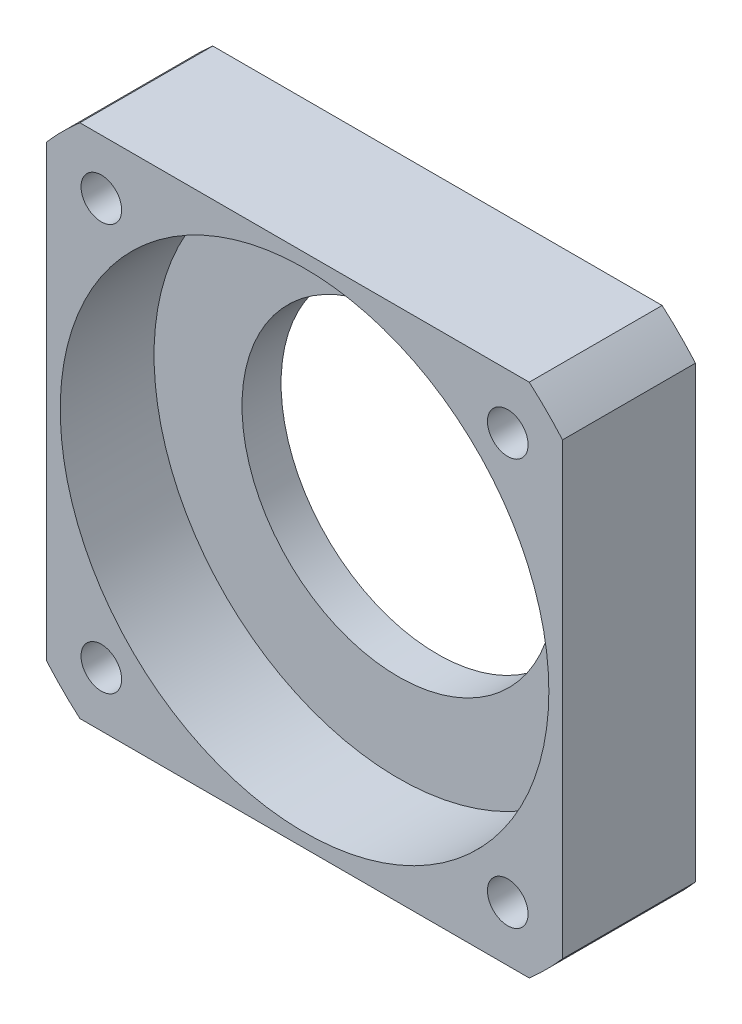
ISO-10303-21;
HEADER;
FILE_DESCRIPTION(('STEP AP214'),'2;1');
FILE_NAME('part.step','',(''),(''),'','','');
FILE_SCHEMA(('AUTOMOTIVE_DESIGN { 1 0 10303 214 1 1 1 1 }'));
ENDSEC;
DATA;
#1=APPLICATION_CONTEXT('core data for automotive mechanical design processes');
#2=APPLICATION_PROTOCOL_DEFINITION('international standard','automotive_design',2000,#1);
#3=PRODUCT_CONTEXT('',#1,'mechanical');
#4=PRODUCT('Part','Part','',(#3));
#5=PRODUCT_RELATED_PRODUCT_CATEGORY('part','',(#4));
#6=PRODUCT_DEFINITION_FORMATION('','',#4);
#7=PRODUCT_DEFINITION_CONTEXT('part definition',#1,'design');
#8=PRODUCT_DEFINITION('design','',#6,#7);
#9=PRODUCT_DEFINITION_SHAPE('','',#8);
#10=(LENGTH_UNIT() NAMED_UNIT(*) SI_UNIT(.MILLI.,.METRE.));
#11=(NAMED_UNIT(*) PLANE_ANGLE_UNIT() SI_UNIT($,.RADIAN.));
#12=(NAMED_UNIT(*) SI_UNIT($,.STERADIAN.) SOLID_ANGLE_UNIT());
#13=UNCERTAINTY_MEASURE_WITH_UNIT(LENGTH_MEASURE(1.E-05),#10,'distance_accuracy_value','');
#14=(GEOMETRIC_REPRESENTATION_CONTEXT(3) GLOBAL_UNCERTAINTY_ASSIGNED_CONTEXT((#13)) GLOBAL_UNIT_ASSIGNED_CONTEXT((#10,
#11,#12)) REPRESENTATION_CONTEXT('',''));
#15=CARTESIAN_POINT('',(0.,0.,0.));
#16=DIRECTION('',(0.,0.,1.));
#17=DIRECTION('',(1.,0.,0.));
#18=AXIS2_PLACEMENT_3D('',#15,#16,#17);
#19=CARTESIAN_POINT('',(20.955,20.955,10.795));
#20=DIRECTION('',(0.,0.,-1.));
#21=DIRECTION('',(-1.,0.,0.));
#22=AXIS2_PLACEMENT_3D('',#19,#20,#21);
#23=CYLINDRICAL_SURFACE('',#22,12.7);
#24=CARTESIAN_POINT('',(20.955,20.955,0.));
#25=DIRECTION('',(0.,0.,1.));
#26=DIRECTION('',(1.,0.,0.));
#27=AXIS2_PLACEMENT_3D('',#24,#25,#26);
#28=CIRCLE('',#27,12.7);
#29=CARTESIAN_POINT('',(33.655,20.955,0.));
#30=VERTEX_POINT('',#29);
#31=EDGE_CURVE('E154',#30,#30,#28,.T.);
#32=ORIENTED_EDGE('',*,*,#31,.F.);
#33=EDGE_LOOP('',(#32));
#34=FACE_BOUND('',#33,.T.);
#35=CARTESIAN_POINT('',(20.955,20.955,3.175));
#36=DIRECTION('',(0.,0.,1.));
#37=DIRECTION('',(1.,0.,0.));
#38=AXIS2_PLACEMENT_3D('',#35,#36,#37);
#39=CIRCLE('',#38,12.7);
#40=CARTESIAN_POINT('',(33.655,20.955,3.175));
#41=VERTEX_POINT('',#40);
#42=EDGE_CURVE('E37',#41,#41,#39,.T.);
#43=ORIENTED_EDGE('',*,*,#42,.T.);
#44=EDGE_LOOP('',(#43));
#45=FACE_BOUND('',#44,.T.);
#46=ADVANCED_FACE('F33',(#34,#45),#23,.F.);
#47=CARTESIAN_POINT('',(0.,0.,10.795));
#48=DIRECTION('',(0.,0.,-1.));
#49=DIRECTION('',(-1.,0.,0.));
#50=AXIS2_PLACEMENT_3D('',#47,#48,#49);
#51=PLANE('',#50);
#52=CARTESIAN_POINT('',(20.955,20.955,10.795));
#53=DIRECTION('',(0.,0.,1.));
#54=DIRECTION('',(1.,0.,0.));
#55=AXIS2_PLACEMENT_3D('',#52,#53,#54);
#56=CIRCLE('',#55,19.84375);
#57=CARTESIAN_POINT('',(40.79875,20.955,10.795));
#58=VERTEX_POINT('',#57);
#59=EDGE_CURVE('E243',#58,#58,#56,.T.);
#60=ORIENTED_EDGE('',*,*,#59,.F.);
#61=EDGE_LOOP('',(#60));
#62=FACE_BOUND('',#61,.T.);
#63=CARTESIAN_POINT('',(4.44928924947582,4.44928924947489,10.795));
#64=DIRECTION('',(0.,0.,1.));
#65=DIRECTION('',(1.,0.,0.));
#66=AXIS2_PLACEMENT_3D('',#63,#64,#65);
#67=CIRCLE('',#66,1.64973);
#68=CARTESIAN_POINT('',(6.09901924947582,4.44928924947489,10.795));
#69=VERTEX_POINT('',#68);
#70=EDGE_CURVE('E188',#69,#69,#67,.T.);
#71=ORIENTED_EDGE('',*,*,#70,.F.);
#72=EDGE_LOOP('',(#71));
#73=FACE_BOUND('',#72,.T.);
#74=CARTESIAN_POINT('',(37.4607107505251,37.4607107505251,10.795));
#75=DIRECTION('',(0.,0.,1.));
#76=DIRECTION('',(1.,0.,0.));
#77=AXIS2_PLACEMENT_3D('',#74,#75,#76);
#78=CIRCLE('',#77,1.64973);
#79=CARTESIAN_POINT('',(39.1104407505251,37.4607107505251,10.795));
#80=VERTEX_POINT('',#79);
#81=EDGE_CURVE('E144',#80,#80,#78,.T.);
#82=ORIENTED_EDGE('',*,*,#81,.F.);
#83=EDGE_LOOP('',(#82));
#84=FACE_BOUND('',#83,.T.);
#85=CARTESIAN_POINT('',(37.4607107505255,4.44928924947537,10.795));
#86=DIRECTION('',(0.,0.,1.));
#87=DIRECTION('',(1.,0.,0.));
#88=AXIS2_PLACEMENT_3D('',#85,#86,#87);
#89=CIRCLE('',#88,1.64973);
#90=CARTESIAN_POINT('',(39.1104407505255,4.44928924947537,10.795));
#91=VERTEX_POINT('',#90);
#92=EDGE_CURVE('E194',#91,#91,#89,.T.);
#93=ORIENTED_EDGE('',*,*,#92,.F.);
#94=EDGE_LOOP('',(#93));
#95=FACE_BOUND('',#94,.T.);
#96=CARTESIAN_POINT('',(4.44928924947507,37.4607107505243,10.795));
#97=DIRECTION('',(0.,0.,1.));
#98=DIRECTION('',(1.,0.,0.));
#99=AXIS2_PLACEMENT_3D('',#96,#97,#98);
#100=CIRCLE('',#99,1.64973);
#101=CARTESIAN_POINT('',(6.09901924947507,37.4607107505243,10.795));
#102=VERTEX_POINT('',#101);
#103=EDGE_CURVE('E182',#102,#102,#100,.T.);
#104=ORIENTED_EDGE('',*,*,#103,.F.);
#105=EDGE_LOOP('',(#104));
#106=FACE_BOUND('',#105,.T.);
#107=CARTESIAN_POINT('',(20.955,20.955,10.795));
#108=DIRECTION('',(0.,0.,1.));
#109=DIRECTION('',(1.,0.,0.));
#110=AXIS2_PLACEMENT_3D('',#107,#108,#109);
#111=CIRCLE('',#110,27.7876);
#112=CARTESIAN_POINT('',(2.70565237439978,41.91,10.795));
#113=VERTEX_POINT('',#112);
#114=CARTESIAN_POINT('',(0.,39.2043476256002,10.795));
#115=VERTEX_POINT('',#114);
#116=EDGE_CURVE('E245',#113,#115,#111,.T.);
#117=ORIENTED_EDGE('',*,*,#116,.T.);
#118=DIRECTION('',(0.,-1.,0.));
#119=VECTOR('',#118,1.);
#120=CARTESIAN_POINT('',(0.,0.,10.795));
#121=LINE('',#120,#119);
#122=CARTESIAN_POINT('',(0.,2.70565237439979,10.795));
#123=VERTEX_POINT('',#122);
#124=EDGE_CURVE('E124',#115,#123,#121,.T.);
#125=ORIENTED_EDGE('',*,*,#124,.T.);
#126=CARTESIAN_POINT('',(2.70565237439979,0.,10.795));
#127=VERTEX_POINT('',#126);
#128=EDGE_CURVE('E166',#123,#127,#111,.T.);
#129=ORIENTED_EDGE('',*,*,#128,.T.);
#130=DIRECTION('',(1.,0.,0.));
#131=VECTOR('',#130,1.);
#132=CARTESIAN_POINT('',(0.,0.,10.795));
#133=LINE('',#132,#131);
#134=CARTESIAN_POINT('',(39.2043476256002,0.,10.795));
#135=VERTEX_POINT('',#134);
#136=EDGE_CURVE('E140',#127,#135,#133,.T.);
#137=ORIENTED_EDGE('',*,*,#136,.T.);
#138=CARTESIAN_POINT('',(41.91,2.70565237439978,10.795));
#139=VERTEX_POINT('',#138);
#140=EDGE_CURVE('E165',#135,#139,#111,.T.);
#141=ORIENTED_EDGE('',*,*,#140,.T.);
#142=DIRECTION('',(0.,1.,0.));
#143=VECTOR('',#142,1.);
#144=CARTESIAN_POINT('',(41.91,0.,10.795));
#145=LINE('',#144,#143);
#146=CARTESIAN_POINT('',(41.91,39.2043476256002,10.795));
#147=VERTEX_POINT('',#146);
#148=EDGE_CURVE('E135',#139,#147,#145,.T.);
#149=ORIENTED_EDGE('',*,*,#148,.T.);
#150=CARTESIAN_POINT('',(39.2043476256002,41.91,10.795));
#151=VERTEX_POINT('',#150);
#152=EDGE_CURVE('E103',#147,#151,#111,.T.);
#153=ORIENTED_EDGE('',*,*,#152,.T.);
#154=DIRECTION('',(-1.,0.,0.));
#155=VECTOR('',#154,1.);
#156=CARTESIAN_POINT('',(0.,41.91,10.795));
#157=LINE('',#156,#155);
#158=EDGE_CURVE('E131',#151,#113,#157,.T.);
#159=ORIENTED_EDGE('',*,*,#158,.T.);
#160=EDGE_LOOP('',(#117,#125,#129,#137,#141,#149,#153,#159));
#161=FACE_BOUND('',#160,.T.);
#162=ADVANCED_FACE('F164',(#62,#73,#84,#95,#106,#161),#51,.F.);
#163=CARTESIAN_POINT('',(0.,0.,0.));
#164=DIRECTION('',(0.,0.,-1.));
#165=DIRECTION('',(-1.,0.,0.));
#166=AXIS2_PLACEMENT_3D('',#163,#164,#165);
#167=PLANE('',#166);
#168=CARTESIAN_POINT('',(4.44928924947582,4.44928924947489,0.));
#169=DIRECTION('',(0.,0.,1.));
#170=DIRECTION('',(1.,0.,0.));
#171=AXIS2_PLACEMENT_3D('',#168,#169,#170);
#172=CIRCLE('',#171,1.64973);
#173=CARTESIAN_POINT('',(6.09901924947582,4.44928924947489,0.));
#174=VERTEX_POINT('',#173);
#175=EDGE_CURVE('E185',#174,#174,#172,.T.);
#176=ORIENTED_EDGE('',*,*,#175,.T.);
#177=EDGE_LOOP('',(#176));
#178=FACE_BOUND('',#177,.T.);
#179=ORIENTED_EDGE('',*,*,#31,.T.);
#180=EDGE_LOOP('',(#179));
#181=FACE_BOUND('',#180,.T.);
#182=CARTESIAN_POINT('',(37.4607107505251,37.4607107505251,0.));
#183=DIRECTION('',(0.,0.,1.));
#184=DIRECTION('',(1.,0.,0.));
#185=AXIS2_PLACEMENT_3D('',#182,#183,#184);
#186=CIRCLE('',#185,1.64973);
#187=CARTESIAN_POINT('',(39.1104407505251,37.4607107505251,0.));
#188=VERTEX_POINT('',#187);
#189=EDGE_CURVE('E149',#188,#188,#186,.T.);
#190=ORIENTED_EDGE('',*,*,#189,.T.);
#191=EDGE_LOOP('',(#190));
#192=FACE_BOUND('',#191,.T.);
#193=CARTESIAN_POINT('',(37.4607107505255,4.44928924947537,0.));
#194=DIRECTION('',(0.,0.,1.));
#195=DIRECTION('',(1.,0.,0.));
#196=AXIS2_PLACEMENT_3D('',#193,#194,#195);
#197=CIRCLE('',#196,1.64973);
#198=CARTESIAN_POINT('',(39.1104407505255,4.44928924947537,0.));
#199=VERTEX_POINT('',#198);
#200=EDGE_CURVE('E191',#199,#199,#197,.T.);
#201=ORIENTED_EDGE('',*,*,#200,.T.);
#202=EDGE_LOOP('',(#201));
#203=FACE_BOUND('',#202,.T.);
#204=CARTESIAN_POINT('',(4.44928924947507,37.4607107505243,0.));
#205=DIRECTION('',(0.,0.,1.));
#206=DIRECTION('',(1.,0.,0.));
#207=AXIS2_PLACEMENT_3D('',#204,#205,#206);
#208=CIRCLE('',#207,1.64973);
#209=CARTESIAN_POINT('',(6.09901924947507,37.4607107505243,0.));
#210=VERTEX_POINT('',#209);
#211=EDGE_CURVE('E181',#210,#210,#208,.T.);
#212=ORIENTED_EDGE('',*,*,#211,.T.);
#213=EDGE_LOOP('',(#212));
#214=FACE_BOUND('',#213,.T.);
#215=DIRECTION('',(0.,-1.,0.));
#216=VECTOR('',#215,1.);
#217=CARTESIAN_POINT('',(0.,0.,0.));
#218=LINE('',#217,#216);
#219=CARTESIAN_POINT('',(0.,39.2043476256002,0.));
#220=VERTEX_POINT('',#219);
#221=CARTESIAN_POINT('',(0.,2.70565237439979,0.));
#222=VERTEX_POINT('',#221);
#223=EDGE_CURVE('E127',#220,#222,#218,.T.);
#224=ORIENTED_EDGE('',*,*,#223,.F.);
#225=CARTESIAN_POINT('',(20.955,20.955,0.));
#226=DIRECTION('',(0.,0.,1.));
#227=DIRECTION('',(1.,0.,0.));
#228=AXIS2_PLACEMENT_3D('',#225,#226,#227);
#229=CIRCLE('',#228,27.7876);
#230=CARTESIAN_POINT('',(2.70565237439978,41.91,0.));
#231=VERTEX_POINT('',#230);
#232=EDGE_CURVE('E119',#231,#220,#229,.T.);
#233=ORIENTED_EDGE('',*,*,#232,.F.);
#234=DIRECTION('',(-1.,0.,0.));
#235=VECTOR('',#234,1.);
#236=CARTESIAN_POINT('',(0.,41.91,0.));
#237=LINE('',#236,#235);
#238=CARTESIAN_POINT('',(39.2043476256002,41.91,0.));
#239=VERTEX_POINT('',#238);
#240=EDGE_CURVE('E118',#239,#231,#237,.T.);
#241=ORIENTED_EDGE('',*,*,#240,.F.);
#242=CARTESIAN_POINT('',(41.91,39.2043476256002,0.));
#243=VERTEX_POINT('',#242);
#244=EDGE_CURVE('E100',#243,#239,#229,.T.);
#245=ORIENTED_EDGE('',*,*,#244,.F.);
#246=DIRECTION('',(0.,1.,0.));
#247=VECTOR('',#246,1.);
#248=CARTESIAN_POINT('',(41.91,0.,0.));
#249=LINE('',#248,#247);
#250=CARTESIAN_POINT('',(41.91,2.70565237439978,0.));
#251=VERTEX_POINT('',#250);
#252=EDGE_CURVE('E115',#251,#243,#249,.T.);
#253=ORIENTED_EDGE('',*,*,#252,.F.);
#254=CARTESIAN_POINT('',(39.2043476256002,0.,0.));
#255=VERTEX_POINT('',#254);
#256=EDGE_CURVE('E57',#255,#251,#229,.T.);
#257=ORIENTED_EDGE('',*,*,#256,.F.);
#258=DIRECTION('',(1.,0.,0.));
#259=VECTOR('',#258,1.);
#260=CARTESIAN_POINT('',(0.,0.,0.));
#261=LINE('',#260,#259);
#262=CARTESIAN_POINT('',(2.70565237439979,0.,0.));
#263=VERTEX_POINT('',#262);
#264=EDGE_CURVE('E122',#263,#255,#261,.T.);
#265=ORIENTED_EDGE('',*,*,#264,.F.);
#266=EDGE_CURVE('E49',#222,#263,#229,.T.);
#267=ORIENTED_EDGE('',*,*,#266,.F.);
#268=EDGE_LOOP('',(#224,#233,#241,#245,#253,#257,#265,#267));
#269=FACE_BOUND('',#268,.T.);
#270=ADVANCED_FACE('F114',(#178,#181,#192,#203,#214,#269),#167,.T.);
#271=CARTESIAN_POINT('',(0.,0.,10.795));
#272=DIRECTION('',(1.,0.,0.));
#273=DIRECTION('',(0.,0.,-1.));
#274=AXIS2_PLACEMENT_3D('',#271,#272,#273);
#275=PLANE('',#274);
#276=DIRECTION('',(0.,0.,1.));
#277=VECTOR('',#276,1.);
#278=CARTESIAN_POINT('',(0.,39.2043476256002,0.));
#279=LINE('',#278,#277);
#280=EDGE_CURVE('E179',#220,#115,#279,.T.);
#281=ORIENTED_EDGE('',*,*,#280,.F.);
#282=ORIENTED_EDGE('',*,*,#223,.T.);
#283=DIRECTION('',(0.,0.,1.));
#284=VECTOR('',#283,1.);
#285=CARTESIAN_POINT('',(0.,2.70565237439979,0.));
#286=LINE('',#285,#284);
#287=EDGE_CURVE('E174',#123,#222,#286,.F.);
#288=ORIENTED_EDGE('',*,*,#287,.F.);
#289=ORIENTED_EDGE('',*,*,#124,.F.);
#290=EDGE_LOOP('',(#281,#282,#288,#289));
#291=FACE_BOUND('',#290,.T.);
#292=ADVANCED_FACE('F35',(#291),#275,.F.);
#293=CARTESIAN_POINT('',(0.,0.,10.795));
#294=DIRECTION('',(0.,1.,0.));
#295=DIRECTION('',(0.,0.,1.));
#296=AXIS2_PLACEMENT_3D('',#293,#294,#295);
#297=PLANE('',#296);
#298=DIRECTION('',(0.,0.,1.));
#299=VECTOR('',#298,1.);
#300=CARTESIAN_POINT('',(2.70565237439979,0.,0.));
#301=LINE('',#300,#299);
#302=EDGE_CURVE('E170',#263,#127,#301,.T.);
#303=ORIENTED_EDGE('',*,*,#302,.F.);
#304=ORIENTED_EDGE('',*,*,#264,.T.);
#305=DIRECTION('',(0.,0.,1.));
#306=VECTOR('',#305,1.);
#307=CARTESIAN_POINT('',(39.2043476256002,0.,0.));
#308=LINE('',#307,#306);
#309=EDGE_CURVE('E172',#135,#255,#308,.F.);
#310=ORIENTED_EDGE('',*,*,#309,.F.);
#311=ORIENTED_EDGE('',*,*,#136,.F.);
#312=EDGE_LOOP('',(#303,#304,#310,#311));
#313=FACE_BOUND('',#312,.T.);
#314=ADVANCED_FACE('F169',(#313),#297,.F.);
#315=CARTESIAN_POINT('',(41.91,0.,10.795));
#316=DIRECTION('',(-1.,0.,0.));
#317=DIRECTION('',(0.,0.,1.));
#318=AXIS2_PLACEMENT_3D('',#315,#316,#317);
#319=PLANE('',#318);
#320=DIRECTION('',(0.,0.,1.));
#321=VECTOR('',#320,1.);
#322=CARTESIAN_POINT('',(41.91,2.70565237439978,0.));
#323=LINE('',#322,#321);
#324=EDGE_CURVE('E108',#251,#139,#323,.T.);
#325=ORIENTED_EDGE('',*,*,#324,.F.);
#326=ORIENTED_EDGE('',*,*,#252,.T.);
#327=DIRECTION('',(0.,0.,1.));
#328=VECTOR('',#327,1.);
#329=CARTESIAN_POINT('',(41.91,39.2043476256002,0.));
#330=LINE('',#329,#328);
#331=EDGE_CURVE('E97',#147,#243,#330,.F.);
#332=ORIENTED_EDGE('',*,*,#331,.F.);
#333=ORIENTED_EDGE('',*,*,#148,.F.);
#334=EDGE_LOOP('',(#325,#326,#332,#333));
#335=FACE_BOUND('',#334,.T.);
#336=ADVANCED_FACE('F121',(#335),#319,.F.);
#337=CARTESIAN_POINT('',(0.,41.91,10.795));
#338=DIRECTION('',(0.,-1.,0.));
#339=DIRECTION('',(0.,0.,-1.));
#340=AXIS2_PLACEMENT_3D('',#337,#338,#339);
#341=PLANE('',#340);
#342=DIRECTION('',(0.,0.,1.));
#343=VECTOR('',#342,1.);
#344=CARTESIAN_POINT('',(39.2043476256002,41.91,0.));
#345=LINE('',#344,#343);
#346=EDGE_CURVE('E11',#239,#151,#345,.T.);
#347=ORIENTED_EDGE('',*,*,#346,.F.);
#348=ORIENTED_EDGE('',*,*,#240,.T.);
#349=DIRECTION('',(0.,0.,1.));
#350=VECTOR('',#349,1.);
#351=CARTESIAN_POINT('',(2.70565237439978,41.91,0.));
#352=LINE('',#351,#350);
#353=EDGE_CURVE('E42',#113,#231,#352,.F.);
#354=ORIENTED_EDGE('',*,*,#353,.F.);
#355=ORIENTED_EDGE('',*,*,#158,.F.);
#356=EDGE_LOOP('',(#347,#348,#354,#355));
#357=FACE_BOUND('',#356,.T.);
#358=ADVANCED_FACE('F214',(#357),#341,.F.);
#359=CARTESIAN_POINT('',(37.4607107505251,37.4607107505251,10.795));
#360=DIRECTION('',(0.,0.,-1.));
#361=DIRECTION('',(-1.,0.,0.));
#362=AXIS2_PLACEMENT_3D('',#359,#360,#361);
#363=CYLINDRICAL_SURFACE('',#362,1.64973);
#364=ORIENTED_EDGE('',*,*,#81,.T.);
#365=EDGE_LOOP('',(#364));
#366=FACE_BOUND('',#365,.T.);
#367=ORIENTED_EDGE('',*,*,#189,.F.);
#368=EDGE_LOOP('',(#367));
#369=FACE_BOUND('',#368,.T.);
#370=ADVANCED_FACE('F204',(#366,#369),#363,.F.);
#371=CARTESIAN_POINT('',(37.4607107505255,4.44928924947537,10.795));
#372=DIRECTION('',(0.,0.,-1.));
#373=DIRECTION('',(-1.,0.,0.));
#374=AXIS2_PLACEMENT_3D('',#371,#372,#373);
#375=CYLINDRICAL_SURFACE('',#374,1.64973);
#376=ORIENTED_EDGE('',*,*,#92,.T.);
#377=EDGE_LOOP('',(#376));
#378=FACE_BOUND('',#377,.T.);
#379=ORIENTED_EDGE('',*,*,#200,.F.);
#380=EDGE_LOOP('',(#379));
#381=FACE_BOUND('',#380,.T.);
#382=ADVANCED_FACE('F201',(#378,#381),#375,.F.);
#383=CARTESIAN_POINT('',(4.44928924947582,4.44928924947489,10.795));
#384=DIRECTION('',(0.,0.,-1.));
#385=DIRECTION('',(-1.,0.,0.));
#386=AXIS2_PLACEMENT_3D('',#383,#384,#385);
#387=CYLINDRICAL_SURFACE('',#386,1.64973);
#388=ORIENTED_EDGE('',*,*,#70,.T.);
#389=EDGE_LOOP('',(#388));
#390=FACE_BOUND('',#389,.T.);
#391=ORIENTED_EDGE('',*,*,#175,.F.);
#392=EDGE_LOOP('',(#391));
#393=FACE_BOUND('',#392,.T.);
#394=ADVANCED_FACE('F203',(#390,#393),#387,.F.);
#395=CARTESIAN_POINT('',(4.44928924947507,37.4607107505243,10.795));
#396=DIRECTION('',(0.,0.,-1.));
#397=DIRECTION('',(-1.,0.,0.));
#398=AXIS2_PLACEMENT_3D('',#395,#396,#397);
#399=CYLINDRICAL_SURFACE('',#398,1.64973);
#400=ORIENTED_EDGE('',*,*,#103,.T.);
#401=EDGE_LOOP('',(#400));
#402=FACE_BOUND('',#401,.T.);
#403=ORIENTED_EDGE('',*,*,#211,.F.);
#404=EDGE_LOOP('',(#403));
#405=FACE_BOUND('',#404,.T.);
#406=ADVANCED_FACE('F211',(#402,#405),#399,.F.);
#407=CARTESIAN_POINT('',(20.955,20.955,0.));
#408=DIRECTION('',(0.,0.,1.));
#409=DIRECTION('',(1.,0.,0.));
#410=AXIS2_PLACEMENT_3D('',#407,#408,#409);
#411=CYLINDRICAL_SURFACE('',#410,27.7876);
#412=ORIENTED_EDGE('',*,*,#280,.T.);
#413=ORIENTED_EDGE('',*,*,#116,.F.);
#414=ORIENTED_EDGE('',*,*,#353,.T.);
#415=ORIENTED_EDGE('',*,*,#232,.T.);
#416=EDGE_LOOP('',(#412,#413,#414,#415));
#417=FACE_BOUND('',#416,.T.);
#418=ADVANCED_FACE('F266',(#417),#411,.T.);
#419=ORIENTED_EDGE('',*,*,#331,.T.);
#420=ORIENTED_EDGE('',*,*,#244,.T.);
#421=ORIENTED_EDGE('',*,*,#346,.T.);
#422=ORIENTED_EDGE('',*,*,#152,.F.);
#423=EDGE_LOOP('',(#419,#420,#421,#422));
#424=FACE_BOUND('',#423,.T.);
#425=ADVANCED_FACE('F99',(#424),#411,.T.);
#426=ORIENTED_EDGE('',*,*,#309,.T.);
#427=ORIENTED_EDGE('',*,*,#256,.T.);
#428=ORIENTED_EDGE('',*,*,#324,.T.);
#429=ORIENTED_EDGE('',*,*,#140,.F.);
#430=EDGE_LOOP('',(#426,#427,#428,#429));
#431=FACE_BOUND('',#430,.T.);
#432=ADVANCED_FACE('F294',(#431),#411,.T.);
#433=ORIENTED_EDGE('',*,*,#287,.T.);
#434=ORIENTED_EDGE('',*,*,#266,.T.);
#435=ORIENTED_EDGE('',*,*,#302,.T.);
#436=ORIENTED_EDGE('',*,*,#128,.F.);
#437=EDGE_LOOP('',(#433,#434,#435,#436));
#438=FACE_BOUND('',#437,.T.);
#439=ADVANCED_FACE('F273',(#438),#411,.T.);
#440=CARTESIAN_POINT('',(20.955,20.955,3.175));
#441=DIRECTION('',(0.,0.,1.));
#442=DIRECTION('',(1.,0.,0.));
#443=AXIS2_PLACEMENT_3D('',#440,#441,#442);
#444=CYLINDRICAL_SURFACE('',#443,19.84375);
#445=CARTESIAN_POINT('',(20.955,20.955,3.175));
#446=DIRECTION('',(0.,0.,1.));
#447=DIRECTION('',(1.,0.,0.));
#448=AXIS2_PLACEMENT_3D('',#445,#446,#447);
#449=CIRCLE('',#448,19.84375);
#450=CARTESIAN_POINT('',(40.79875,20.955,3.175));
#451=VERTEX_POINT('',#450);
#452=EDGE_CURVE('E247',#451,#451,#449,.T.);
#453=CARTESIAN_POINT('',(40.79875,20.955,3.175));
#454=CARTESIAN_POINT('',(40.79875,20.955,3.254375));
#455=CARTESIAN_POINT('',(40.79875,20.955,3.33375));
#456=CARTESIAN_POINT('',(40.79875,20.955,3.4925));
#457=CARTESIAN_POINT('',(40.79875,20.955,3.571875));
#458=CARTESIAN_POINT('',(40.79875,20.955,3.730625));
#459=CARTESIAN_POINT('',(40.79875,20.955,3.81));
#460=CARTESIAN_POINT('',(40.79875,20.955,3.96875));
#461=CARTESIAN_POINT('',(40.79875,20.955,4.048125));
#462=CARTESIAN_POINT('',(40.79875,20.955,4.206875));
#463=CARTESIAN_POINT('',(40.79875,20.955,4.28625));
#464=CARTESIAN_POINT('',(40.79875,20.955,4.445));
#465=CARTESIAN_POINT('',(40.79875,20.955,4.524375));
#466=CARTESIAN_POINT('',(40.79875,20.955,4.683125));
#467=CARTESIAN_POINT('',(40.79875,20.955,4.7625));
#468=CARTESIAN_POINT('',(40.79875,20.955,4.92125));
#469=CARTESIAN_POINT('',(40.79875,20.955,5.000625));
#470=CARTESIAN_POINT('',(40.79875,20.955,5.159375));
#471=CARTESIAN_POINT('',(40.79875,20.955,5.23875));
#472=CARTESIAN_POINT('',(40.79875,20.955,5.3975));
#473=CARTESIAN_POINT('',(40.79875,20.955,5.476875));
#474=CARTESIAN_POINT('',(40.79875,20.955,5.635625));
#475=CARTESIAN_POINT('',(40.79875,20.955,5.715));
#476=CARTESIAN_POINT('',(40.79875,20.955,5.87375));
#477=CARTESIAN_POINT('',(40.79875,20.955,5.953125));
#478=CARTESIAN_POINT('',(40.79875,20.955,6.111875));
#479=CARTESIAN_POINT('',(40.79875,20.955,6.19125));
#480=CARTESIAN_POINT('',(40.79875,20.955,6.35));
#481=CARTESIAN_POINT('',(40.79875,20.955,6.429375));
#482=CARTESIAN_POINT('',(40.79875,20.955,6.588125));
#483=CARTESIAN_POINT('',(40.79875,20.955,6.6675));
#484=CARTESIAN_POINT('',(40.79875,20.955,6.82625));
#485=CARTESIAN_POINT('',(40.79875,20.955,6.905625));
#486=CARTESIAN_POINT('',(40.79875,20.955,7.064375));
#487=CARTESIAN_POINT('',(40.79875,20.955,7.14375));
#488=CARTESIAN_POINT('',(40.79875,20.955,7.3025));
#489=CARTESIAN_POINT('',(40.79875,20.955,7.381875));
#490=CARTESIAN_POINT('',(40.79875,20.955,7.540625));
#491=CARTESIAN_POINT('',(40.79875,20.955,7.62));
#492=CARTESIAN_POINT('',(40.79875,20.955,7.77875));
#493=CARTESIAN_POINT('',(40.79875,20.955,7.858125));
#494=CARTESIAN_POINT('',(40.79875,20.955,8.016875));
#495=CARTESIAN_POINT('',(40.79875,20.955,8.09625));
#496=CARTESIAN_POINT('',(40.79875,20.955,8.255));
#497=CARTESIAN_POINT('',(40.79875,20.955,8.334375));
#498=CARTESIAN_POINT('',(40.79875,20.955,8.493125));
#499=CARTESIAN_POINT('',(40.79875,20.955,8.5725));
#500=CARTESIAN_POINT('',(40.79875,20.955,8.73125));
#501=CARTESIAN_POINT('',(40.79875,20.955,8.810625));
#502=CARTESIAN_POINT('',(40.79875,20.955,8.969375));
#503=CARTESIAN_POINT('',(40.79875,20.955,9.04875));
#504=CARTESIAN_POINT('',(40.79875,20.955,9.2075));
#505=CARTESIAN_POINT('',(40.79875,20.955,9.286875));
#506=CARTESIAN_POINT('',(40.79875,20.955,9.445625));
#507=CARTESIAN_POINT('',(40.79875,20.955,9.525));
#508=CARTESIAN_POINT('',(40.79875,20.955,9.68375));
#509=CARTESIAN_POINT('',(40.79875,20.955,9.763125));
#510=CARTESIAN_POINT('',(40.79875,20.955,9.921875));
#511=CARTESIAN_POINT('',(40.79875,20.955,10.00125));
#512=CARTESIAN_POINT('',(40.79875,20.955,10.16));
#513=CARTESIAN_POINT('',(40.79875,20.955,10.239375));
#514=CARTESIAN_POINT('',(40.79875,20.955,10.398125));
#515=CARTESIAN_POINT('',(40.79875,20.955,10.4775));
#516=CARTESIAN_POINT('',(40.79875,20.955,10.63625));
#517=CARTESIAN_POINT('',(40.79875,20.955,10.715625));
#518=CARTESIAN_POINT('',(40.79875,20.955,10.795));
#519=B_SPLINE_CURVE_WITH_KNOTS('',3,(#453,#454,#455,#456,#457,#458,#459,#460,#461,#462,#463,
#464,#465,#466,#467,#468,#469,#470,#471,#472,#473,#474,#475,#476,#477,#478,#479,#480,#481,#482,
#483,#484,#485,#486,#487,#488,#489,#490,#491,#492,#493,#494,#495,#496,#497,#498,#499,#500,#501,
#502,#503,#504,#505,#506,#507,#508,#509,#510,#511,#512,#513,#514,#515,#516,#517,#518),
.UNSPECIFIED.,.F.,.F.,(4,2,2,2,2,2,2,2,2,2,2,2,2,2,2,2,2,2,2,2,2,2,2,2,2,2,2,2,2,2,2,2,4),(0.,
0.238125,0.47625,0.714375,0.952499999999999,1.190625,1.42875,1.666875,1.905,2.143125,2.38125,
2.619375,2.8575,3.095625,3.33375,3.571875,3.81,4.048125,4.28625,4.524375,4.7625,5.000625,
5.23875,5.476875,5.715,5.953125,6.19125,6.429375,6.6675,6.905625,7.14375,7.381875,7.62),.UNSPECIFIED.);
#520=EDGE_CURVE('BSEAM255',#451,#58,#519,.T.);
#521=ORIENTED_EDGE('',*,*,#452,.F.);
#522=ORIENTED_EDGE('',*,*,#59,.T.);
#523=ORIENTED_EDGE('',*,*,#520,.T.);
#524=ORIENTED_EDGE('',*,*,#520,.F.);
#525=EDGE_LOOP('',(#521,#523,#522,#524));
#526=FACE_BOUND('',#525,.T.);
#527=ADVANCED_FACE('F255',(#526),#444,.F.);
#528=CARTESIAN_POINT('',(20.955,20.955,3.175));
#529=DIRECTION('',(0.,0.,1.));
#530=DIRECTION('',(1.,0.,0.));
#531=AXIS2_PLACEMENT_3D('',#528,#529,#530);
#532=PLANE('',#531);
#533=ORIENTED_EDGE('',*,*,#42,.F.);
#534=EDGE_LOOP('',(#533));
#535=FACE_BOUND('',#534,.T.);
#536=ORIENTED_EDGE('',*,*,#452,.T.);
#537=EDGE_LOOP('',(#536));
#538=FACE_BOUND('',#537,.T.);
#539=ADVANCED_FACE('F277',(#535,#538),#532,.T.);
#540=CLOSED_SHELL('',(#46,#162,#270,#292,#314,#336,#358,#370,#382,#394,#406,#418,#425,#432,#439,
#527,#539));
#541=MANIFOLD_SOLID_BREP('B2',#540);
#542=ADVANCED_BREP_SHAPE_REPRESENTATION('',(#18,#541),#14);
#543=SHAPE_DEFINITION_REPRESENTATION(#9,#542);
ENDSEC;
END-ISO-10303-21;
